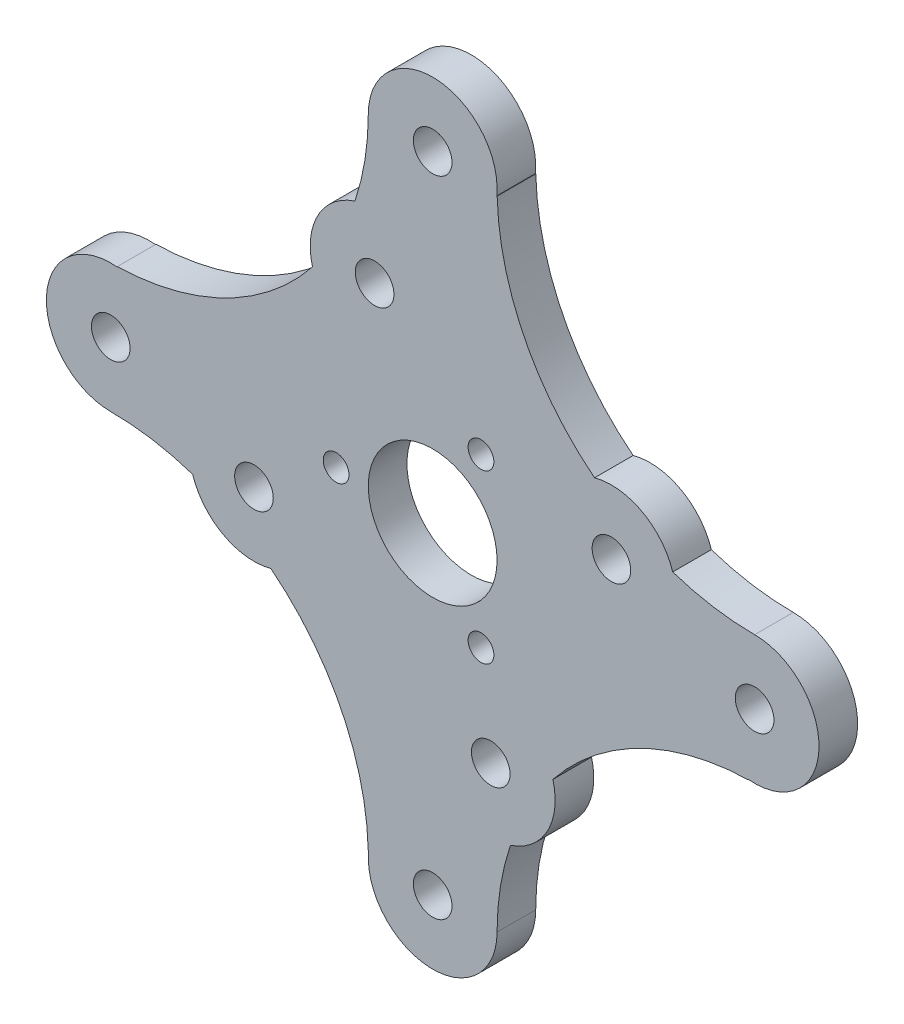
ISO-10303-21;
HEADER;
FILE_DESCRIPTION(('STEP AP214'),'2;1');
FILE_NAME('part.step','',(''),(''),'','','');
FILE_SCHEMA(('AUTOMOTIVE_DESIGN { 1 0 10303 214 1 1 1 1 }'));
ENDSEC;
DATA;
#1=APPLICATION_CONTEXT('core data for automotive mechanical design processes');
#2=APPLICATION_PROTOCOL_DEFINITION('international standard','automotive_design',2000,#1);
#3=PRODUCT_CONTEXT('',#1,'mechanical');
#4=PRODUCT('Part','Part','',(#3));
#5=PRODUCT_RELATED_PRODUCT_CATEGORY('part','',(#4));
#6=PRODUCT_DEFINITION_FORMATION('','',#4);
#7=PRODUCT_DEFINITION_CONTEXT('part definition',#1,'design');
#8=PRODUCT_DEFINITION('design','',#6,#7);
#9=PRODUCT_DEFINITION_SHAPE('','',#8);
#10=(LENGTH_UNIT() NAMED_UNIT(*) SI_UNIT(.MILLI.,.METRE.));
#11=(NAMED_UNIT(*) PLANE_ANGLE_UNIT() SI_UNIT($,.RADIAN.));
#12=(NAMED_UNIT(*) SI_UNIT($,.STERADIAN.) SOLID_ANGLE_UNIT());
#13=UNCERTAINTY_MEASURE_WITH_UNIT(LENGTH_MEASURE(1.E-05),#10,'distance_accuracy_value','');
#14=(GEOMETRIC_REPRESENTATION_CONTEXT(3) GLOBAL_UNCERTAINTY_ASSIGNED_CONTEXT((#13)) GLOBAL_UNIT_ASSIGNED_CONTEXT((#10,
#11,#12)) REPRESENTATION_CONTEXT('',''));
#15=CARTESIAN_POINT('',(0.,0.,0.));
#16=DIRECTION('',(0.,0.,1.));
#17=DIRECTION('',(1.,0.,0.));
#18=AXIS2_PLACEMENT_3D('',#15,#16,#17);
#19=CARTESIAN_POINT('',(13.8796616293915,4.50977544043731,3.));
#20=DIRECTION('',(0.,0.,-1.));
#21=DIRECTION('',(-1.,0.,0.));
#22=AXIS2_PLACEMENT_3D('',#19,#20,#21);
#23=CYLINDRICAL_SURFACE('',#22,5.);
#24=CARTESIAN_POINT('',(13.8796616293915,4.50977544043731,0.));
#25=DIRECTION('',(0.,0.,1.));
#26=DIRECTION('',(1.,0.,0.));
#27=AXIS2_PLACEMENT_3D('',#24,#25,#26);
#28=CIRCLE('',#27,5.);
#29=CARTESIAN_POINT('',(18.6403696579388,6.03806175750134,0.));
#30=VERTEX_POINT('',#29);
#31=CARTESIAN_POINT('',(12.5667239097199,9.33431630400803,0.));
#32=VERTEX_POINT('',#31);
#33=EDGE_CURVE('E236',#30,#32,#28,.T.);
#34=ORIENTED_EDGE('',*,*,#33,.T.);
#35=DIRECTION('',(0.,0.,-1.));
#36=VECTOR('',#35,1.);
#37=CARTESIAN_POINT('',(12.5667239097199,9.33431630400803,3.));
#38=LINE('',#37,#36);
#39=CARTESIAN_POINT('',(12.5667239097199,9.33431630400803,3.));
#40=VERTEX_POINT('',#39);
#41=EDGE_CURVE('E11',#40,#32,#38,.T.);
#42=ORIENTED_EDGE('',*,*,#41,.F.);
#43=CARTESIAN_POINT('',(13.8796616293915,4.50977544043731,3.));
#44=DIRECTION('',(0.,0.,1.));
#45=DIRECTION('',(1.,0.,0.));
#46=AXIS2_PLACEMENT_3D('',#43,#44,#45);
#47=CIRCLE('',#46,5.);
#48=CARTESIAN_POINT('',(18.6403696579388,6.03806175750134,3.));
#49=VERTEX_POINT('',#48);
#50=EDGE_CURVE('E126',#49,#40,#47,.T.);
#51=ORIENTED_EDGE('',*,*,#50,.F.);
#52=DIRECTION('',(0.,0.,-1.));
#53=VECTOR('',#52,1.);
#54=CARTESIAN_POINT('',(18.6403696579388,6.03806175750134,3.));
#55=LINE('',#54,#53);
#56=EDGE_CURVE('E52',#49,#30,#55,.T.);
#57=ORIENTED_EDGE('',*,*,#56,.T.);
#58=EDGE_LOOP('',(#34,#42,#51,#57));
#59=FACE_BOUND('',#58,.T.);
#60=ADVANCED_FACE('F35',(#59),#23,.T.);
#61=CARTESIAN_POINT('',(25.0000000000001,25.0000000000001,3.));
#62=DIRECTION('',(0.,0.,-1.));
#63=DIRECTION('',(-1.,0.,0.));
#64=AXIS2_PLACEMENT_3D('',#61,#62,#63);
#65=CYLINDRICAL_SURFACE('',#64,20.0000000000001);
#66=CARTESIAN_POINT('',(25.0000000000001,25.0000000000001,0.));
#67=DIRECTION('',(0.,0.,1.));
#68=DIRECTION('',(1.,0.,0.));
#69=AXIS2_PLACEMENT_3D('',#66,#67,#68);
#70=CIRCLE('',#69,20.0000000000001);
#71=CARTESIAN_POINT('',(5.00641236504747,24.4935876349525,0.));
#72=VERTEX_POINT('',#71);
#73=EDGE_CURVE('E238',#72,#32,#70,.T.);
#74=ORIENTED_EDGE('',*,*,#73,.F.);
#75=DIRECTION('',(0.,0.,-1.));
#76=VECTOR('',#75,1.);
#77=CARTESIAN_POINT('',(5.00641236504747,24.4935876349525,3.));
#78=LINE('',#77,#76);
#79=CARTESIAN_POINT('',(5.00641236504747,24.4935876349525,3.));
#80=VERTEX_POINT('',#79);
#81=EDGE_CURVE('E44',#80,#72,#78,.T.);
#82=ORIENTED_EDGE('',*,*,#81,.F.);
#83=CARTESIAN_POINT('',(25.0000000000001,25.0000000000001,3.));
#84=DIRECTION('',(0.,0.,1.));
#85=DIRECTION('',(1.,0.,0.));
#86=AXIS2_PLACEMENT_3D('',#83,#84,#85);
#87=CIRCLE('',#86,20.0000000000001);
#88=EDGE_CURVE('E204',#80,#40,#87,.T.);
#89=ORIENTED_EDGE('',*,*,#88,.T.);
#90=ORIENTED_EDGE('',*,*,#41,.T.);
#91=EDGE_LOOP('',(#74,#82,#89,#90));
#92=FACE_BOUND('',#91,.T.);
#93=ADVANCED_FACE('F341',(#92),#65,.F.);
#94=CARTESIAN_POINT('',(0.,0.,3.));
#95=DIRECTION('',(0.,0.,-1.));
#96=DIRECTION('',(-1.,0.,0.));
#97=AXIS2_PLACEMENT_3D('',#94,#95,#96);
#98=CYLINDRICAL_SURFACE('',#97,25.);
#99=CARTESIAN_POINT('',(0.,0.,0.));
#100=DIRECTION('',(0.,0.,1.));
#101=DIRECTION('',(1.,0.,0.));
#102=AXIS2_PLACEMENT_3D('',#99,#100,#101);
#103=CIRCLE('',#102,25.);
#104=CARTESIAN_POINT('',(4.9749371855331,24.5,0.));
#105=VERTEX_POINT('',#104);
#106=EDGE_CURVE('E241',#72,#105,#103,.T.);
#107=ORIENTED_EDGE('',*,*,#106,.T.);
#108=DIRECTION('',(0.,0.,-1.));
#109=VECTOR('',#108,1.);
#110=CARTESIAN_POINT('',(4.9749371855331,24.5,3.));
#111=LINE('',#110,#109);
#112=CARTESIAN_POINT('',(4.9749371855331,24.5,3.));
#113=VERTEX_POINT('',#112);
#114=EDGE_CURVE('E326',#113,#105,#111,.T.);
#115=ORIENTED_EDGE('',*,*,#114,.F.);
#116=CARTESIAN_POINT('',(0.,0.,3.));
#117=DIRECTION('',(0.,0.,1.));
#118=DIRECTION('',(1.,0.,0.));
#119=AXIS2_PLACEMENT_3D('',#116,#117,#118);
#120=CIRCLE('',#119,25.);
#121=EDGE_CURVE('E189',#80,#113,#120,.T.);
#122=ORIENTED_EDGE('',*,*,#121,.F.);
#123=ORIENTED_EDGE('',*,*,#81,.T.);
#124=EDGE_LOOP('',(#107,#115,#122,#123));
#125=FACE_BOUND('',#124,.T.);
#126=ADVANCED_FACE('F331',(#125),#98,.T.);
#127=CARTESIAN_POINT('',(0.,25.,3.));
#128=DIRECTION('',(0.,0.,-1.));
#129=DIRECTION('',(-1.,0.,0.));
#130=AXIS2_PLACEMENT_3D('',#127,#128,#129);
#131=CYLINDRICAL_SURFACE('',#130,5.);
#132=CARTESIAN_POINT('',(0.,25.,0.));
#133=DIRECTION('',(0.,0.,1.));
#134=DIRECTION('',(1.,0.,0.));
#135=AXIS2_PLACEMENT_3D('',#132,#133,#134);
#136=CIRCLE('',#135,5.);
#137=CARTESIAN_POINT('',(-5.,25.,0.));
#138=VERTEX_POINT('',#137);
#139=EDGE_CURVE('E244',#105,#138,#136,.T.);
#140=ORIENTED_EDGE('',*,*,#139,.T.);
#141=DIRECTION('',(0.,0.,-1.));
#142=VECTOR('',#141,1.);
#143=CARTESIAN_POINT('',(-5.,25.,3.));
#144=LINE('',#143,#142);
#145=CARTESIAN_POINT('',(-5.,25.,3.));
#146=VERTEX_POINT('',#145);
#147=EDGE_CURVE('E323',#146,#138,#144,.T.);
#148=ORIENTED_EDGE('',*,*,#147,.F.);
#149=CARTESIAN_POINT('',(0.,25.,3.));
#150=DIRECTION('',(0.,0.,1.));
#151=DIRECTION('',(1.,0.,0.));
#152=AXIS2_PLACEMENT_3D('',#149,#150,#151);
#153=CIRCLE('',#152,5.);
#154=EDGE_CURVE('E552',#113,#146,#153,.T.);
#155=ORIENTED_EDGE('',*,*,#154,.F.);
#156=ORIENTED_EDGE('',*,*,#114,.T.);
#157=EDGE_LOOP('',(#140,#148,#155,#156));
#158=FACE_BOUND('',#157,.T.);
#159=ADVANCED_FACE('F365',(#158),#131,.T.);
#160=CARTESIAN_POINT('',(-25.,25.,3.));
#161=DIRECTION('',(0.,0.,-1.));
#162=DIRECTION('',(-1.,0.,0.));
#163=AXIS2_PLACEMENT_3D('',#160,#161,#162);
#164=CYLINDRICAL_SURFACE('',#163,20.);
#165=CARTESIAN_POINT('',(-25.,25.,0.));
#166=DIRECTION('',(0.,0.,1.));
#167=DIRECTION('',(1.,0.,0.));
#168=AXIS2_PLACEMENT_3D('',#165,#166,#167);
#169=CIRCLE('',#168,20.);
#170=CARTESIAN_POINT('',(-6.03806175750132,18.6403696579388,0.));
#171=VERTEX_POINT('',#170);
#172=EDGE_CURVE('E247',#138,#171,#169,.F.);
#173=ORIENTED_EDGE('',*,*,#172,.T.);
#174=DIRECTION('',(0.,0.,-1.));
#175=VECTOR('',#174,1.);
#176=CARTESIAN_POINT('',(-6.03806175750132,18.6403696579388,3.));
#177=LINE('',#176,#175);
#178=CARTESIAN_POINT('',(-6.03806175750132,18.6403696579388,3.));
#179=VERTEX_POINT('',#178);
#180=EDGE_CURVE('E320',#179,#171,#177,.T.);
#181=ORIENTED_EDGE('',*,*,#180,.F.);
#182=CARTESIAN_POINT('',(-25.,25.,3.));
#183=DIRECTION('',(0.,0.,1.));
#184=DIRECTION('',(1.,0.,0.));
#185=AXIS2_PLACEMENT_3D('',#182,#183,#184);
#186=CIRCLE('',#185,20.);
#187=EDGE_CURVE('E555',#146,#179,#186,.F.);
#188=ORIENTED_EDGE('',*,*,#187,.F.);
#189=ORIENTED_EDGE('',*,*,#147,.T.);
#190=EDGE_LOOP('',(#173,#181,#188,#189));
#191=FACE_BOUND('',#190,.T.);
#192=ADVANCED_FACE('F640',(#191),#164,.F.);
#193=CARTESIAN_POINT('',(-4.50977544043731,13.8796616293915,3.));
#194=DIRECTION('',(0.,0.,-1.));
#195=DIRECTION('',(-1.,0.,0.));
#196=AXIS2_PLACEMENT_3D('',#193,#194,#195);
#197=CYLINDRICAL_SURFACE('',#196,5.);
#198=CARTESIAN_POINT('',(-4.50977544043731,13.8796616293915,0.));
#199=DIRECTION('',(0.,0.,1.));
#200=DIRECTION('',(1.,0.,0.));
#201=AXIS2_PLACEMENT_3D('',#198,#199,#200);
#202=CIRCLE('',#201,5.);
#203=CARTESIAN_POINT('',(-9.33431630400802,12.5667239097199,0.));
#204=VERTEX_POINT('',#203);
#205=EDGE_CURVE('E249',#171,#204,#202,.T.);
#206=ORIENTED_EDGE('',*,*,#205,.T.);
#207=DIRECTION('',(0.,0.,-1.));
#208=VECTOR('',#207,1.);
#209=CARTESIAN_POINT('',(-9.33431630400802,12.5667239097199,3.));
#210=LINE('',#209,#208);
#211=CARTESIAN_POINT('',(-9.33431630400802,12.5667239097199,3.));
#212=VERTEX_POINT('',#211);
#213=EDGE_CURVE('E317',#212,#204,#210,.T.);
#214=ORIENTED_EDGE('',*,*,#213,.F.);
#215=CARTESIAN_POINT('',(-4.50977544043731,13.8796616293915,3.));
#216=DIRECTION('',(0.,0.,1.));
#217=DIRECTION('',(1.,0.,0.));
#218=AXIS2_PLACEMENT_3D('',#215,#216,#217);
#219=CIRCLE('',#218,5.);
#220=EDGE_CURVE('E557',#179,#212,#219,.T.);
#221=ORIENTED_EDGE('',*,*,#220,.F.);
#222=ORIENTED_EDGE('',*,*,#180,.T.);
#223=EDGE_LOOP('',(#206,#214,#221,#222));
#224=FACE_BOUND('',#223,.T.);
#225=ADVANCED_FACE('F638',(#224),#197,.T.);
#226=CARTESIAN_POINT('',(-24.4935876349525,5.00641236504747,0.));
#227=VERTEX_POINT('',#226);
#228=EDGE_CURVE('E250',#204,#227,#169,.F.);
#229=ORIENTED_EDGE('',*,*,#228,.T.);
#230=DIRECTION('',(0.,0.,-1.));
#231=VECTOR('',#230,1.);
#232=CARTESIAN_POINT('',(-24.4935876349525,5.00641236504747,3.));
#233=LINE('',#232,#231);
#234=CARTESIAN_POINT('',(-24.4935876349525,5.00641236504747,3.));
#235=VERTEX_POINT('',#234);
#236=EDGE_CURVE('E314',#235,#227,#233,.T.);
#237=ORIENTED_EDGE('',*,*,#236,.F.);
#238=EDGE_CURVE('E558',#212,#235,#186,.F.);
#239=ORIENTED_EDGE('',*,*,#238,.F.);
#240=ORIENTED_EDGE('',*,*,#213,.T.);
#241=EDGE_LOOP('',(#229,#237,#239,#240));
#242=FACE_BOUND('',#241,.T.);
#243=ADVANCED_FACE('F589',(#242),#164,.F.);
#244=CARTESIAN_POINT('',(-24.5,4.9749371855331,0.));
#245=VERTEX_POINT('',#244);
#246=EDGE_CURVE('E245',#227,#245,#103,.T.);
#247=ORIENTED_EDGE('',*,*,#246,.T.);
#248=DIRECTION('',(0.,0.,-1.));
#249=VECTOR('',#248,1.);
#250=CARTESIAN_POINT('',(-24.5,4.9749371855331,3.));
#251=LINE('',#250,#249);
#252=CARTESIAN_POINT('',(-24.5,4.9749371855331,3.));
#253=VERTEX_POINT('',#252);
#254=EDGE_CURVE('E311',#253,#245,#251,.T.);
#255=ORIENTED_EDGE('',*,*,#254,.F.);
#256=EDGE_CURVE('E553',#235,#253,#120,.T.);
#257=ORIENTED_EDGE('',*,*,#256,.F.);
#258=ORIENTED_EDGE('',*,*,#236,.T.);
#259=EDGE_LOOP('',(#247,#255,#257,#258));
#260=FACE_BOUND('',#259,.T.);
#261=ADVANCED_FACE('F594',(#260),#98,.T.);
#262=CARTESIAN_POINT('',(-25.,0.,3.));
#263=DIRECTION('',(0.,0.,-1.));
#264=DIRECTION('',(-1.,0.,0.));
#265=AXIS2_PLACEMENT_3D('',#262,#263,#264);
#266=CYLINDRICAL_SURFACE('',#265,5.);
#267=CARTESIAN_POINT('',(-25.,0.,0.));
#268=DIRECTION('',(0.,0.,1.));
#269=DIRECTION('',(1.,0.,0.));
#270=AXIS2_PLACEMENT_3D('',#267,#268,#269);
#271=CIRCLE('',#270,5.);
#272=CARTESIAN_POINT('',(-25.,-5.,0.));
#273=VERTEX_POINT('',#272);
#274=EDGE_CURVE('E252',#245,#273,#271,.T.);
#275=ORIENTED_EDGE('',*,*,#274,.T.);
#276=DIRECTION('',(0.,0.,-1.));
#277=VECTOR('',#276,1.);
#278=CARTESIAN_POINT('',(-25.,-5.,3.));
#279=LINE('',#278,#277);
#280=CARTESIAN_POINT('',(-25.,-5.,3.));
#281=VERTEX_POINT('',#280);
#282=EDGE_CURVE('E309',#281,#273,#279,.T.);
#283=ORIENTED_EDGE('',*,*,#282,.F.);
#284=CARTESIAN_POINT('',(-25.,0.,3.));
#285=DIRECTION('',(0.,0.,1.));
#286=DIRECTION('',(1.,0.,0.));
#287=AXIS2_PLACEMENT_3D('',#284,#285,#286);
#288=CIRCLE('',#287,5.);
#289=EDGE_CURVE('E560',#253,#281,#288,.T.);
#290=ORIENTED_EDGE('',*,*,#289,.F.);
#291=ORIENTED_EDGE('',*,*,#254,.T.);
#292=EDGE_LOOP('',(#275,#283,#290,#291));
#293=FACE_BOUND('',#292,.T.);
#294=ADVANCED_FACE('F600',(#293),#266,.T.);
#295=CARTESIAN_POINT('',(-25.0000000000002,-25.0000000000002,3.));
#296=DIRECTION('',(0.,0.,-1.));
#297=DIRECTION('',(-1.,0.,0.));
#298=AXIS2_PLACEMENT_3D('',#295,#296,#297);
#299=CYLINDRICAL_SURFACE('',#298,20.0000000000002);
#300=CARTESIAN_POINT('',(-25.0000000000002,-25.0000000000002,0.));
#301=DIRECTION('',(0.,0.,1.));
#302=DIRECTION('',(1.,0.,0.));
#303=AXIS2_PLACEMENT_3D('',#300,#301,#302);
#304=CIRCLE('',#303,20.0000000000002);
#305=CARTESIAN_POINT('',(-18.6403696579388,-6.03806175750137,0.));
#306=VERTEX_POINT('',#305);
#307=EDGE_CURVE('E255',#306,#273,#304,.T.);
#308=ORIENTED_EDGE('',*,*,#307,.F.);
#309=DIRECTION('',(0.,0.,-1.));
#310=VECTOR('',#309,1.);
#311=CARTESIAN_POINT('',(-18.6403696579388,-6.03806175750137,3.));
#312=LINE('',#311,#310);
#313=CARTESIAN_POINT('',(-18.6403696579388,-6.03806175750137,3.));
#314=VERTEX_POINT('',#313);
#315=EDGE_CURVE('E307',#314,#306,#312,.T.);
#316=ORIENTED_EDGE('',*,*,#315,.F.);
#317=CARTESIAN_POINT('',(-25.0000000000002,-25.0000000000002,3.));
#318=DIRECTION('',(0.,0.,1.));
#319=DIRECTION('',(1.,0.,0.));
#320=AXIS2_PLACEMENT_3D('',#317,#318,#319);
#321=CIRCLE('',#320,20.0000000000002);
#322=EDGE_CURVE('E562',#314,#281,#321,.T.);
#323=ORIENTED_EDGE('',*,*,#322,.T.);
#324=ORIENTED_EDGE('',*,*,#282,.T.);
#325=EDGE_LOOP('',(#308,#316,#323,#324));
#326=FACE_BOUND('',#325,.T.);
#327=ADVANCED_FACE('F629',(#326),#299,.F.);
#328=CARTESIAN_POINT('',(-13.8796616293915,-4.50977544043731,3.));
#329=DIRECTION('',(0.,0.,-1.));
#330=DIRECTION('',(-1.,0.,0.));
#331=AXIS2_PLACEMENT_3D('',#328,#329,#330);
#332=CYLINDRICAL_SURFACE('',#331,5.);
#333=CARTESIAN_POINT('',(-13.8796616293915,-4.50977544043731,0.));
#334=DIRECTION('',(0.,0.,1.));
#335=DIRECTION('',(1.,0.,0.));
#336=AXIS2_PLACEMENT_3D('',#333,#334,#335);
#337=CIRCLE('',#336,5.);
#338=CARTESIAN_POINT('',(-12.56672390972,-9.33431630400804,0.));
#339=VERTEX_POINT('',#338);
#340=EDGE_CURVE('E258',#306,#339,#337,.T.);
#341=ORIENTED_EDGE('',*,*,#340,.T.);
#342=DIRECTION('',(0.,0.,-1.));
#343=VECTOR('',#342,1.);
#344=CARTESIAN_POINT('',(-12.56672390972,-9.33431630400804,3.));
#345=LINE('',#344,#343);
#346=CARTESIAN_POINT('',(-12.56672390972,-9.33431630400804,3.));
#347=VERTEX_POINT('',#346);
#348=EDGE_CURVE('E305',#347,#339,#345,.T.);
#349=ORIENTED_EDGE('',*,*,#348,.F.);
#350=CARTESIAN_POINT('',(-13.8796616293915,-4.50977544043731,3.));
#351=DIRECTION('',(0.,0.,1.));
#352=DIRECTION('',(1.,0.,0.));
#353=AXIS2_PLACEMENT_3D('',#350,#351,#352);
#354=CIRCLE('',#353,5.);
#355=EDGE_CURVE('E565',#314,#347,#354,.T.);
#356=ORIENTED_EDGE('',*,*,#355,.F.);
#357=ORIENTED_EDGE('',*,*,#315,.T.);
#358=EDGE_LOOP('',(#341,#349,#356,#357));
#359=FACE_BOUND('',#358,.T.);
#360=ADVANCED_FACE('F612',(#359),#332,.T.);
#361=CARTESIAN_POINT('',(-5.00641236504747,-24.4935876349525,0.));
#362=VERTEX_POINT('',#361);
#363=EDGE_CURVE('E259',#362,#339,#304,.T.);
#364=ORIENTED_EDGE('',*,*,#363,.F.);
#365=DIRECTION('',(0.,0.,-1.));
#366=VECTOR('',#365,1.);
#367=CARTESIAN_POINT('',(-5.00641236504747,-24.4935876349525,3.));
#368=LINE('',#367,#366);
#369=CARTESIAN_POINT('',(-5.00641236504747,-24.4935876349525,3.));
#370=VERTEX_POINT('',#369);
#371=EDGE_CURVE('E303',#370,#362,#368,.T.);
#372=ORIENTED_EDGE('',*,*,#371,.F.);
#373=EDGE_CURVE('E566',#370,#347,#321,.T.);
#374=ORIENTED_EDGE('',*,*,#373,.T.);
#375=ORIENTED_EDGE('',*,*,#348,.T.);
#376=EDGE_LOOP('',(#364,#372,#374,#375));
#377=FACE_BOUND('',#376,.T.);
#378=ADVANCED_FACE('F608',(#377),#299,.F.);
#379=CARTESIAN_POINT('',(-4.9749371855331,-24.5,0.));
#380=VERTEX_POINT('',#379);
#381=EDGE_CURVE('E266',#362,#380,#103,.T.);
#382=ORIENTED_EDGE('',*,*,#381,.T.);
#383=DIRECTION('',(0.,0.,-1.));
#384=VECTOR('',#383,1.);
#385=CARTESIAN_POINT('',(-4.9749371855331,-24.5,3.));
#386=LINE('',#385,#384);
#387=CARTESIAN_POINT('',(-4.9749371855331,-24.5,3.));
#388=VERTEX_POINT('',#387);
#389=EDGE_CURVE('E300',#388,#380,#386,.T.);
#390=ORIENTED_EDGE('',*,*,#389,.F.);
#391=EDGE_CURVE('E188',#370,#388,#120,.T.);
#392=ORIENTED_EDGE('',*,*,#391,.F.);
#393=ORIENTED_EDGE('',*,*,#371,.T.);
#394=EDGE_LOOP('',(#382,#390,#392,#393));
#395=FACE_BOUND('',#394,.T.);
#396=ADVANCED_FACE('F619',(#395),#98,.T.);
#397=CARTESIAN_POINT('',(0.,-25.,3.));
#398=DIRECTION('',(0.,0.,-1.));
#399=DIRECTION('',(-1.,0.,0.));
#400=AXIS2_PLACEMENT_3D('',#397,#398,#399);
#401=CYLINDRICAL_SURFACE('',#400,5.);
#402=CARTESIAN_POINT('',(0.,-25.,0.));
#403=DIRECTION('',(0.,0.,1.));
#404=DIRECTION('',(1.,0.,0.));
#405=AXIS2_PLACEMENT_3D('',#402,#403,#404);
#406=CIRCLE('',#405,5.);
#407=CARTESIAN_POINT('',(5.,-25.,0.));
#408=VERTEX_POINT('',#407);
#409=EDGE_CURVE('E262',#380,#408,#406,.T.);
#410=ORIENTED_EDGE('',*,*,#409,.T.);
#411=DIRECTION('',(0.,0.,-1.));
#412=VECTOR('',#411,1.);
#413=CARTESIAN_POINT('',(5.,-25.,3.));
#414=LINE('',#413,#412);
#415=CARTESIAN_POINT('',(5.,-25.,3.));
#416=VERTEX_POINT('',#415);
#417=EDGE_CURVE('E298',#416,#408,#414,.T.);
#418=ORIENTED_EDGE('',*,*,#417,.F.);
#419=CARTESIAN_POINT('',(0.,-25.,3.));
#420=DIRECTION('',(0.,0.,1.));
#421=DIRECTION('',(1.,0.,0.));
#422=AXIS2_PLACEMENT_3D('',#419,#420,#421);
#423=CIRCLE('',#422,5.);
#424=EDGE_CURVE('E568',#388,#416,#423,.T.);
#425=ORIENTED_EDGE('',*,*,#424,.F.);
#426=ORIENTED_EDGE('',*,*,#389,.T.);
#427=EDGE_LOOP('',(#410,#418,#425,#426));
#428=FACE_BOUND('',#427,.T.);
#429=ADVANCED_FACE('F617',(#428),#401,.T.);
#430=CARTESIAN_POINT('',(25.,-25.,3.));
#431=DIRECTION('',(0.,0.,-1.));
#432=DIRECTION('',(-1.,0.,0.));
#433=AXIS2_PLACEMENT_3D('',#430,#431,#432);
#434=CYLINDRICAL_SURFACE('',#433,20.);
#435=CARTESIAN_POINT('',(25.,-25.,0.));
#436=DIRECTION('',(0.,0.,1.));
#437=DIRECTION('',(1.,0.,0.));
#438=AXIS2_PLACEMENT_3D('',#435,#436,#437);
#439=CIRCLE('',#438,20.);
#440=CARTESIAN_POINT('',(6.03806175750132,-18.6403696579388,0.));
#441=VERTEX_POINT('',#440);
#442=EDGE_CURVE('E265',#441,#408,#439,.T.);
#443=ORIENTED_EDGE('',*,*,#442,.F.);
#444=DIRECTION('',(0.,0.,-1.));
#445=VECTOR('',#444,1.);
#446=CARTESIAN_POINT('',(6.03806175750132,-18.6403696579388,3.));
#447=LINE('',#446,#445);
#448=CARTESIAN_POINT('',(6.03806175750132,-18.6403696579388,3.));
#449=VERTEX_POINT('',#448);
#450=EDGE_CURVE('E296',#449,#441,#447,.T.);
#451=ORIENTED_EDGE('',*,*,#450,.F.);
#452=CARTESIAN_POINT('',(25.,-25.,3.));
#453=DIRECTION('',(0.,0.,1.));
#454=DIRECTION('',(1.,0.,0.));
#455=AXIS2_PLACEMENT_3D('',#452,#453,#454);
#456=CIRCLE('',#455,20.);
#457=EDGE_CURVE('E569',#449,#416,#456,.T.);
#458=ORIENTED_EDGE('',*,*,#457,.T.);
#459=ORIENTED_EDGE('',*,*,#417,.T.);
#460=EDGE_LOOP('',(#443,#451,#458,#459));
#461=FACE_BOUND('',#460,.T.);
#462=ADVANCED_FACE('F626',(#461),#434,.F.);
#463=CARTESIAN_POINT('',(4.50977544043731,-13.8796616293915,3.));
#464=DIRECTION('',(0.,0.,-1.));
#465=DIRECTION('',(-1.,0.,0.));
#466=AXIS2_PLACEMENT_3D('',#463,#464,#465);
#467=CYLINDRICAL_SURFACE('',#466,5.);
#468=CARTESIAN_POINT('',(4.50977544043731,-13.8796616293915,0.));
#469=DIRECTION('',(0.,0.,1.));
#470=DIRECTION('',(1.,0.,0.));
#471=AXIS2_PLACEMENT_3D('',#468,#469,#470);
#472=CIRCLE('',#471,5.);
#473=CARTESIAN_POINT('',(9.33431630400803,-12.5667239097199,0.));
#474=VERTEX_POINT('',#473);
#475=EDGE_CURVE('E269',#441,#474,#472,.T.);
#476=ORIENTED_EDGE('',*,*,#475,.T.);
#477=DIRECTION('',(0.,0.,-1.));
#478=VECTOR('',#477,1.);
#479=CARTESIAN_POINT('',(9.33431630400803,-12.5667239097199,3.));
#480=LINE('',#479,#478);
#481=CARTESIAN_POINT('',(9.33431630400803,-12.5667239097199,3.));
#482=VERTEX_POINT('',#481);
#483=EDGE_CURVE('E294',#482,#474,#480,.T.);
#484=ORIENTED_EDGE('',*,*,#483,.F.);
#485=CARTESIAN_POINT('',(4.50977544043731,-13.8796616293915,3.));
#486=DIRECTION('',(0.,0.,1.));
#487=DIRECTION('',(1.,0.,0.));
#488=AXIS2_PLACEMENT_3D('',#485,#486,#487);
#489=CIRCLE('',#488,5.);
#490=EDGE_CURVE('E207',#449,#482,#489,.T.);
#491=ORIENTED_EDGE('',*,*,#490,.F.);
#492=ORIENTED_EDGE('',*,*,#450,.T.);
#493=EDGE_LOOP('',(#476,#484,#491,#492));
#494=FACE_BOUND('',#493,.T.);
#495=ADVANCED_FACE('F662',(#494),#467,.T.);
#496=CARTESIAN_POINT('',(24.4935876349525,-5.00641236504746,0.));
#497=VERTEX_POINT('',#496);
#498=EDGE_CURVE('E270',#497,#474,#439,.T.);
#499=ORIENTED_EDGE('',*,*,#498,.F.);
#500=DIRECTION('',(0.,0.,-1.));
#501=VECTOR('',#500,1.);
#502=CARTESIAN_POINT('',(24.4935876349525,-5.00641236504746,3.));
#503=LINE('',#502,#501);
#504=CARTESIAN_POINT('',(24.4935876349525,-5.00641236504746,3.));
#505=VERTEX_POINT('',#504);
#506=EDGE_CURVE('E197',#505,#497,#503,.T.);
#507=ORIENTED_EDGE('',*,*,#506,.F.);
#508=EDGE_CURVE('E185',#505,#482,#456,.T.);
#509=ORIENTED_EDGE('',*,*,#508,.T.);
#510=ORIENTED_EDGE('',*,*,#483,.T.);
#511=EDGE_LOOP('',(#499,#507,#509,#510));
#512=FACE_BOUND('',#511,.T.);
#513=ADVANCED_FACE('F575',(#512),#434,.F.);
#514=CARTESIAN_POINT('',(24.5,-4.9749371855331,0.));
#515=VERTEX_POINT('',#514);
#516=EDGE_CURVE('E194',#497,#515,#103,.T.);
#517=ORIENTED_EDGE('',*,*,#516,.T.);
#518=DIRECTION('',(0.,0.,-1.));
#519=VECTOR('',#518,1.);
#520=CARTESIAN_POINT('',(24.5,-4.9749371855331,3.));
#521=LINE('',#520,#519);
#522=CARTESIAN_POINT('',(24.5,-4.9749371855331,3.));
#523=VERTEX_POINT('',#522);
#524=EDGE_CURVE('E191',#523,#515,#521,.T.);
#525=ORIENTED_EDGE('',*,*,#524,.F.);
#526=EDGE_CURVE('E178',#505,#523,#120,.T.);
#527=ORIENTED_EDGE('',*,*,#526,.F.);
#528=ORIENTED_EDGE('',*,*,#506,.T.);
#529=EDGE_LOOP('',(#517,#525,#527,#528));
#530=FACE_BOUND('',#529,.T.);
#531=ADVANCED_FACE('F192',(#530),#98,.T.);
#532=CARTESIAN_POINT('',(25.,0.,3.));
#533=DIRECTION('',(0.,0.,-1.));
#534=DIRECTION('',(-1.,0.,0.));
#535=AXIS2_PLACEMENT_3D('',#532,#533,#534);
#536=CYLINDRICAL_SURFACE('',#535,5.);
#537=CARTESIAN_POINT('',(25.,0.,0.));
#538=DIRECTION('',(0.,0.,1.));
#539=DIRECTION('',(1.,0.,0.));
#540=AXIS2_PLACEMENT_3D('',#537,#538,#539);
#541=CIRCLE('',#540,5.);
#542=CARTESIAN_POINT('',(25.,5.,0.));
#543=VERTEX_POINT('',#542);
#544=EDGE_CURVE('E273',#515,#543,#541,.T.);
#545=ORIENTED_EDGE('',*,*,#544,.T.);
#546=DIRECTION('',(0.,0.,-1.));
#547=VECTOR('',#546,1.);
#548=CARTESIAN_POINT('',(25.,5.,3.));
#549=LINE('',#548,#547);
#550=CARTESIAN_POINT('',(25.,5.,3.));
#551=VERTEX_POINT('',#550);
#552=EDGE_CURVE('E114',#551,#543,#549,.T.);
#553=ORIENTED_EDGE('',*,*,#552,.F.);
#554=CARTESIAN_POINT('',(25.,0.,3.));
#555=DIRECTION('',(0.,0.,1.));
#556=DIRECTION('',(1.,0.,0.));
#557=AXIS2_PLACEMENT_3D('',#554,#555,#556);
#558=CIRCLE('',#557,5.);
#559=EDGE_CURVE('E183',#523,#551,#558,.T.);
#560=ORIENTED_EDGE('',*,*,#559,.F.);
#561=ORIENTED_EDGE('',*,*,#524,.T.);
#562=EDGE_LOOP('',(#545,#553,#560,#561));
#563=FACE_BOUND('',#562,.T.);
#564=ADVANCED_FACE('F199',(#563),#536,.T.);
#565=CARTESIAN_POINT('',(-4.50977544043731,13.8796616293915,3.));
#566=DIRECTION('',(0.,0.,-1.));
#567=DIRECTION('',(-1.,0.,0.));
#568=AXIS2_PLACEMENT_3D('',#565,#566,#567);
#569=CYLINDRICAL_SURFACE('',#568,1.5);
#570=CARTESIAN_POINT('',(-4.50977544043731,13.8796616293915,3.));
#571=DIRECTION('',(0.,0.,1.));
#572=DIRECTION('',(1.,0.,0.));
#573=AXIS2_PLACEMENT_3D('',#570,#571,#572);
#574=CIRCLE('',#573,1.5);
#575=CARTESIAN_POINT('',(-3.00977544043731,13.8796616293915,3.));
#576=VERTEX_POINT('',#575);
#577=EDGE_CURVE('E217',#576,#576,#574,.T.);
#578=ORIENTED_EDGE('',*,*,#577,.T.);
#579=EDGE_LOOP('',(#578));
#580=FACE_BOUND('',#579,.T.);
#581=CARTESIAN_POINT('',(-4.50977544043731,13.8796616293915,0.));
#582=DIRECTION('',(0.,0.,1.));
#583=DIRECTION('',(1.,0.,0.));
#584=AXIS2_PLACEMENT_3D('',#581,#582,#583);
#585=CIRCLE('',#584,1.5);
#586=CARTESIAN_POINT('',(-3.00977544043731,13.8796616293915,0.));
#587=VERTEX_POINT('',#586);
#588=EDGE_CURVE('E284',#587,#587,#585,.T.);
#589=ORIENTED_EDGE('',*,*,#588,.F.);
#590=EDGE_LOOP('',(#589));
#591=FACE_BOUND('',#590,.T.);
#592=ADVANCED_FACE('F409',(#580,#591),#569,.F.);
#593=CARTESIAN_POINT('',(-13.8796616293915,-4.50977544043731,3.));
#594=DIRECTION('',(0.,0.,-1.));
#595=DIRECTION('',(-1.,0.,0.));
#596=AXIS2_PLACEMENT_3D('',#593,#594,#595);
#597=CYLINDRICAL_SURFACE('',#596,1.5);
#598=CARTESIAN_POINT('',(-13.8796616293915,-4.50977544043731,3.));
#599=DIRECTION('',(0.,0.,1.));
#600=DIRECTION('',(1.,0.,0.));
#601=AXIS2_PLACEMENT_3D('',#598,#599,#600);
#602=CIRCLE('',#601,1.5);
#603=CARTESIAN_POINT('',(-12.3796616293915,-4.50977544043731,3.));
#604=VERTEX_POINT('',#603);
#605=EDGE_CURVE('E214',#604,#604,#602,.T.);
#606=ORIENTED_EDGE('',*,*,#605,.T.);
#607=EDGE_LOOP('',(#606));
#608=FACE_BOUND('',#607,.T.);
#609=CARTESIAN_POINT('',(-13.8796616293915,-4.50977544043731,0.));
#610=DIRECTION('',(0.,0.,1.));
#611=DIRECTION('',(1.,0.,0.));
#612=AXIS2_PLACEMENT_3D('',#609,#610,#611);
#613=CIRCLE('',#612,1.5);
#614=CARTESIAN_POINT('',(-12.3796616293915,-4.50977544043731,0.));
#615=VERTEX_POINT('',#614);
#616=EDGE_CURVE('E281',#615,#615,#613,.T.);
#617=ORIENTED_EDGE('',*,*,#616,.F.);
#618=EDGE_LOOP('',(#617));
#619=FACE_BOUND('',#618,.T.);
#620=ADVANCED_FACE('F412',(#608,#619),#597,.F.);
#621=CARTESIAN_POINT('',(0.,0.,3.));
#622=DIRECTION('',(0.,0.,-1.));
#623=DIRECTION('',(-1.,0.,0.));
#624=AXIS2_PLACEMENT_3D('',#621,#622,#623);
#625=CYLINDRICAL_SURFACE('',#624,5.);
#626=CARTESIAN_POINT('',(0.,0.,3.));
#627=DIRECTION('',(0.,0.,1.));
#628=DIRECTION('',(1.,0.,0.));
#629=AXIS2_PLACEMENT_3D('',#626,#627,#628);
#630=CIRCLE('',#629,5.);
#631=CARTESIAN_POINT('',(5.,0.,3.));
#632=VERTEX_POINT('',#631);
#633=EDGE_CURVE('E211',#632,#632,#630,.T.);
#634=ORIENTED_EDGE('',*,*,#633,.T.);
#635=EDGE_LOOP('',(#634));
#636=FACE_BOUND('',#635,.T.);
#637=CARTESIAN_POINT('',(0.,0.,0.));
#638=DIRECTION('',(0.,0.,1.));
#639=DIRECTION('',(1.,0.,0.));
#640=AXIS2_PLACEMENT_3D('',#637,#638,#639);
#641=CIRCLE('',#640,5.);
#642=CARTESIAN_POINT('',(5.,0.,0.));
#643=VERTEX_POINT('',#642);
#644=EDGE_CURVE('E278',#643,#643,#641,.T.);
#645=ORIENTED_EDGE('',*,*,#644,.F.);
#646=EDGE_LOOP('',(#645));
#647=FACE_BOUND('',#646,.T.);
#648=ADVANCED_FACE('F355',(#636,#647),#625,.F.);
#649=CARTESIAN_POINT('',(13.8796616293915,4.50977544043731,3.));
#650=DIRECTION('',(0.,0.,-1.));
#651=DIRECTION('',(-1.,0.,0.));
#652=AXIS2_PLACEMENT_3D('',#649,#650,#651);
#653=CYLINDRICAL_SURFACE('',#652,1.5);
#654=CARTESIAN_POINT('',(13.8796616293915,4.50977544043731,3.));
#655=DIRECTION('',(0.,0.,1.));
#656=DIRECTION('',(1.,0.,0.));
#657=AXIS2_PLACEMENT_3D('',#654,#655,#656);
#658=CIRCLE('',#657,1.5);
#659=CARTESIAN_POINT('',(15.3796616293915,4.50977544043731,3.));
#660=VERTEX_POINT('',#659);
#661=EDGE_CURVE('E202',#660,#660,#658,.T.);
#662=ORIENTED_EDGE('',*,*,#661,.T.);
#663=EDGE_LOOP('',(#662));
#664=FACE_BOUND('',#663,.T.);
#665=CARTESIAN_POINT('',(13.8796616293915,4.50977544043731,0.));
#666=DIRECTION('',(0.,0.,1.));
#667=DIRECTION('',(1.,0.,0.));
#668=AXIS2_PLACEMENT_3D('',#665,#666,#667);
#669=CIRCLE('',#668,1.5);
#670=CARTESIAN_POINT('',(15.3796616293915,4.50977544043731,0.));
#671=VERTEX_POINT('',#670);
#672=EDGE_CURVE('E275',#671,#671,#669,.T.);
#673=ORIENTED_EDGE('',*,*,#672,.F.);
#674=EDGE_LOOP('',(#673));
#675=FACE_BOUND('',#674,.T.);
#676=ADVANCED_FACE('F346',(#664,#675),#653,.F.);
#677=EDGE_CURVE('E242',#30,#543,#70,.T.);
#678=ORIENTED_EDGE('',*,*,#677,.F.);
#679=ORIENTED_EDGE('',*,*,#56,.F.);
#680=EDGE_CURVE('E200',#49,#551,#87,.T.);
#681=ORIENTED_EDGE('',*,*,#680,.T.);
#682=ORIENTED_EDGE('',*,*,#552,.T.);
#683=EDGE_LOOP('',(#678,#679,#681,#682));
#684=FACE_BOUND('',#683,.T.);
#685=ADVANCED_FACE('F343',(#684),#65,.F.);
#686=CARTESIAN_POINT('',(0.,-25.,3.));
#687=DIRECTION('',(0.,0.,-1.));
#688=DIRECTION('',(-1.,0.,0.));
#689=AXIS2_PLACEMENT_3D('',#686,#687,#688);
#690=CYLINDRICAL_SURFACE('',#689,1.5);
#691=CARTESIAN_POINT('',(0.,-25.,3.));
#692=DIRECTION('',(0.,0.,1.));
#693=DIRECTION('',(1.,0.,0.));
#694=AXIS2_PLACEMENT_3D('',#691,#692,#693);
#695=CIRCLE('',#694,1.5);
#696=CARTESIAN_POINT('',(1.5,-25.,3.));
#697=VERTEX_POINT('',#696);
#698=EDGE_CURVE('E548',#697,#697,#695,.T.);
#699=ORIENTED_EDGE('',*,*,#698,.T.);
#700=EDGE_LOOP('',(#699));
#701=FACE_BOUND('',#700,.T.);
#702=CARTESIAN_POINT('',(0.,-25.,0.));
#703=DIRECTION('',(0.,0.,1.));
#704=DIRECTION('',(1.,0.,0.));
#705=AXIS2_PLACEMENT_3D('',#702,#703,#704);
#706=CIRCLE('',#705,1.5);
#707=CARTESIAN_POINT('',(1.5,-25.,0.));
#708=VERTEX_POINT('',#707);
#709=EDGE_CURVE('E233',#708,#708,#706,.T.);
#710=ORIENTED_EDGE('',*,*,#709,.F.);
#711=EDGE_LOOP('',(#710));
#712=FACE_BOUND('',#711,.T.);
#713=ADVANCED_FACE('F345',(#701,#712),#690,.F.);
#714=CARTESIAN_POINT('',(-25.,0.,3.));
#715=DIRECTION('',(0.,0.,-1.));
#716=DIRECTION('',(-1.,0.,0.));
#717=AXIS2_PLACEMENT_3D('',#714,#715,#716);
#718=CYLINDRICAL_SURFACE('',#717,1.5);
#719=CARTESIAN_POINT('',(-25.,0.,3.));
#720=DIRECTION('',(0.,0.,1.));
#721=DIRECTION('',(1.,0.,0.));
#722=AXIS2_PLACEMENT_3D('',#719,#720,#721);
#723=CIRCLE('',#722,1.5);
#724=CARTESIAN_POINT('',(-23.5,0.,3.));
#725=VERTEX_POINT('',#724);
#726=EDGE_CURVE('E545',#725,#725,#723,.T.);
#727=ORIENTED_EDGE('',*,*,#726,.T.);
#728=EDGE_LOOP('',(#727));
#729=FACE_BOUND('',#728,.T.);
#730=CARTESIAN_POINT('',(-25.,0.,0.));
#731=DIRECTION('',(0.,0.,1.));
#732=DIRECTION('',(1.,0.,0.));
#733=AXIS2_PLACEMENT_3D('',#730,#731,#732);
#734=CIRCLE('',#733,1.5);
#735=CARTESIAN_POINT('',(-23.5,0.,0.));
#736=VERTEX_POINT('',#735);
#737=EDGE_CURVE('E230',#736,#736,#734,.T.);
#738=ORIENTED_EDGE('',*,*,#737,.F.);
#739=EDGE_LOOP('',(#738));
#740=FACE_BOUND('',#739,.T.);
#741=ADVANCED_FACE('F352',(#729,#740),#718,.F.);
#742=CARTESIAN_POINT('',(0.,25.,3.));
#743=DIRECTION('',(0.,0.,-1.));
#744=DIRECTION('',(-1.,0.,0.));
#745=AXIS2_PLACEMENT_3D('',#742,#743,#744);
#746=CYLINDRICAL_SURFACE('',#745,1.5);
#747=CARTESIAN_POINT('',(0.,25.,3.));
#748=DIRECTION('',(0.,0.,1.));
#749=DIRECTION('',(1.,0.,0.));
#750=AXIS2_PLACEMENT_3D('',#747,#748,#749);
#751=CIRCLE('',#750,1.5);
#752=CARTESIAN_POINT('',(1.5,25.,3.));
#753=VERTEX_POINT('',#752);
#754=EDGE_CURVE('E381',#753,#753,#751,.T.);
#755=ORIENTED_EDGE('',*,*,#754,.T.);
#756=EDGE_LOOP('',(#755));
#757=FACE_BOUND('',#756,.T.);
#758=CARTESIAN_POINT('',(0.,25.,0.));
#759=DIRECTION('',(0.,0.,1.));
#760=DIRECTION('',(1.,0.,0.));
#761=AXIS2_PLACEMENT_3D('',#758,#759,#760);
#762=CIRCLE('',#761,1.5);
#763=CARTESIAN_POINT('',(1.5,25.,0.));
#764=VERTEX_POINT('',#763);
#765=EDGE_CURVE('E226',#764,#764,#762,.T.);
#766=ORIENTED_EDGE('',*,*,#765,.F.);
#767=EDGE_LOOP('',(#766));
#768=FACE_BOUND('',#767,.T.);
#769=ADVANCED_FACE('F369',(#757,#768),#746,.F.);
#770=CARTESIAN_POINT('',(25.,0.,3.));
#771=DIRECTION('',(0.,0.,-1.));
#772=DIRECTION('',(-1.,0.,0.));
#773=AXIS2_PLACEMENT_3D('',#770,#771,#772);
#774=CYLINDRICAL_SURFACE('',#773,1.5);
#775=CARTESIAN_POINT('',(25.,0.,3.));
#776=DIRECTION('',(0.,0.,1.));
#777=DIRECTION('',(1.,0.,0.));
#778=AXIS2_PLACEMENT_3D('',#775,#776,#777);
#779=CIRCLE('',#778,1.5);
#780=CARTESIAN_POINT('',(26.5,0.,3.));
#781=VERTEX_POINT('',#780);
#782=EDGE_CURVE('E290',#781,#781,#779,.T.);
#783=ORIENTED_EDGE('',*,*,#782,.T.);
#784=EDGE_LOOP('',(#783));
#785=FACE_BOUND('',#784,.T.);
#786=CARTESIAN_POINT('',(25.,0.,0.));
#787=DIRECTION('',(0.,0.,1.));
#788=DIRECTION('',(1.,0.,0.));
#789=AXIS2_PLACEMENT_3D('',#786,#787,#788);
#790=CIRCLE('',#789,1.5);
#791=CARTESIAN_POINT('',(26.5,0.,0.));
#792=VERTEX_POINT('',#791);
#793=EDGE_CURVE('E223',#792,#792,#790,.T.);
#794=ORIENTED_EDGE('',*,*,#793,.F.);
#795=EDGE_LOOP('',(#794));
#796=FACE_BOUND('',#795,.T.);
#797=ADVANCED_FACE('F37',(#785,#796),#774,.F.);
#798=CARTESIAN_POINT('',(4.50977544043731,-13.8796616293915,3.));
#799=DIRECTION('',(0.,0.,-1.));
#800=DIRECTION('',(-1.,0.,0.));
#801=AXIS2_PLACEMENT_3D('',#798,#799,#800);
#802=CYLINDRICAL_SURFACE('',#801,1.5);
#803=CARTESIAN_POINT('',(4.50977544043731,-13.8796616293915,3.));
#804=DIRECTION('',(0.,0.,1.));
#805=DIRECTION('',(1.,0.,0.));
#806=AXIS2_PLACEMENT_3D('',#803,#804,#805);
#807=CIRCLE('',#806,1.5);
#808=CARTESIAN_POINT('',(6.00977544043731,-13.8796616293915,3.));
#809=VERTEX_POINT('',#808);
#810=EDGE_CURVE('E220',#809,#809,#807,.T.);
#811=ORIENTED_EDGE('',*,*,#810,.T.);
#812=EDGE_LOOP('',(#811));
#813=FACE_BOUND('',#812,.T.);
#814=CARTESIAN_POINT('',(4.50977544043731,-13.8796616293915,0.));
#815=DIRECTION('',(0.,0.,1.));
#816=DIRECTION('',(1.,0.,0.));
#817=AXIS2_PLACEMENT_3D('',#814,#815,#816);
#818=CIRCLE('',#817,1.5);
#819=CARTESIAN_POINT('',(6.00977544043731,-13.8796616293915,0.));
#820=VERTEX_POINT('',#819);
#821=EDGE_CURVE('E287',#820,#820,#818,.T.);
#822=ORIENTED_EDGE('',*,*,#821,.F.);
#823=EDGE_LOOP('',(#822));
#824=FACE_BOUND('',#823,.T.);
#825=ADVANCED_FACE('F376',(#813,#824),#802,.F.);
#826=CARTESIAN_POINT('',(0.,0.,3.));
#827=DIRECTION('',(0.,0.,1.));
#828=DIRECTION('',(1.,0.,0.));
#829=AXIS2_PLACEMENT_3D('',#826,#827,#828);
#830=PLANE('',#829);
#831=CARTESIAN_POINT('',(3.74999999999994,6.49519052838332,3.));
#832=DIRECTION('',(0.,0.,1.));
#833=DIRECTION('',(1.,0.,0.));
#834=AXIS2_PLACEMENT_3D('',#831,#832,#833);
#835=CIRCLE('',#834,1.);
#836=CARTESIAN_POINT('',(4.74999999999994,6.49519052838332,3.));
#837=VERTEX_POINT('',#836);
#838=EDGE_CURVE('E526',#837,#837,#835,.T.);
#839=ORIENTED_EDGE('',*,*,#838,.F.);
#840=EDGE_LOOP('',(#839));
#841=FACE_BOUND('',#840,.T.);
#842=CARTESIAN_POINT('',(-7.5,0.,3.));
#843=DIRECTION('',(0.,0.,1.));
#844=DIRECTION('',(1.,0.,0.));
#845=AXIS2_PLACEMENT_3D('',#842,#843,#844);
#846=CIRCLE('',#845,1.);
#847=CARTESIAN_POINT('',(-6.5,0.,3.));
#848=VERTEX_POINT('',#847);
#849=EDGE_CURVE('E527',#848,#848,#846,.T.);
#850=ORIENTED_EDGE('',*,*,#849,.F.);
#851=EDGE_LOOP('',(#850));
#852=FACE_BOUND('',#851,.T.);
#853=CARTESIAN_POINT('',(3.75000000000003,-6.49519052838327,3.));
#854=DIRECTION('',(0.,0.,1.));
#855=DIRECTION('',(1.,0.,0.));
#856=AXIS2_PLACEMENT_3D('',#853,#854,#855);
#857=CIRCLE('',#856,1.);
#858=CARTESIAN_POINT('',(4.75000000000003,-6.49519052838327,3.));
#859=VERTEX_POINT('',#858);
#860=EDGE_CURVE('E536',#859,#859,#857,.T.);
#861=ORIENTED_EDGE('',*,*,#860,.F.);
#862=EDGE_LOOP('',(#861));
#863=FACE_BOUND('',#862,.T.);
#864=ORIENTED_EDGE('',*,*,#782,.F.);
#865=EDGE_LOOP('',(#864));
#866=FACE_BOUND('',#865,.T.);
#867=ORIENTED_EDGE('',*,*,#754,.F.);
#868=EDGE_LOOP('',(#867));
#869=FACE_BOUND('',#868,.T.);
#870=ORIENTED_EDGE('',*,*,#726,.F.);
#871=EDGE_LOOP('',(#870));
#872=FACE_BOUND('',#871,.T.);
#873=ORIENTED_EDGE('',*,*,#698,.F.);
#874=EDGE_LOOP('',(#873));
#875=FACE_BOUND('',#874,.T.);
#876=ORIENTED_EDGE('',*,*,#50,.T.);
#877=ORIENTED_EDGE('',*,*,#88,.F.);
#878=ORIENTED_EDGE('',*,*,#121,.T.);
#879=ORIENTED_EDGE('',*,*,#154,.T.);
#880=ORIENTED_EDGE('',*,*,#187,.T.);
#881=ORIENTED_EDGE('',*,*,#220,.T.);
#882=ORIENTED_EDGE('',*,*,#238,.T.);
#883=ORIENTED_EDGE('',*,*,#256,.T.);
#884=ORIENTED_EDGE('',*,*,#289,.T.);
#885=ORIENTED_EDGE('',*,*,#322,.F.);
#886=ORIENTED_EDGE('',*,*,#355,.T.);
#887=ORIENTED_EDGE('',*,*,#373,.F.);
#888=ORIENTED_EDGE('',*,*,#391,.T.);
#889=ORIENTED_EDGE('',*,*,#424,.T.);
#890=ORIENTED_EDGE('',*,*,#457,.F.);
#891=ORIENTED_EDGE('',*,*,#490,.T.);
#892=ORIENTED_EDGE('',*,*,#508,.F.);
#893=ORIENTED_EDGE('',*,*,#526,.T.);
#894=ORIENTED_EDGE('',*,*,#559,.T.);
#895=ORIENTED_EDGE('',*,*,#680,.F.);
#896=EDGE_LOOP('',(#876,#877,#878,#879,#880,#881,#882,#883,#884,#885,#886,#887,#888,#889,#890,
#891,#892,#893,#894,#895));
#897=FACE_BOUND('',#896,.T.);
#898=ORIENTED_EDGE('',*,*,#661,.F.);
#899=EDGE_LOOP('',(#898));
#900=FACE_BOUND('',#899,.T.);
#901=ORIENTED_EDGE('',*,*,#633,.F.);
#902=EDGE_LOOP('',(#901));
#903=FACE_BOUND('',#902,.T.);
#904=ORIENTED_EDGE('',*,*,#605,.F.);
#905=EDGE_LOOP('',(#904));
#906=FACE_BOUND('',#905,.T.);
#907=ORIENTED_EDGE('',*,*,#577,.F.);
#908=EDGE_LOOP('',(#907));
#909=FACE_BOUND('',#908,.T.);
#910=ORIENTED_EDGE('',*,*,#810,.F.);
#911=EDGE_LOOP('',(#910));
#912=FACE_BOUND('',#911,.T.);
#913=ADVANCED_FACE('F180',(#841,#852,#863,#866,#869,#872,#875,#897,#900,#903,#906,#909,#912),
#830,.T.);
#914=CARTESIAN_POINT('',(0.,0.,0.));
#915=DIRECTION('',(0.,0.,1.));
#916=DIRECTION('',(1.,0.,0.));
#917=AXIS2_PLACEMENT_3D('',#914,#915,#916);
#918=PLANE('',#917);
#919=CARTESIAN_POINT('',(3.74999999999994,6.49519052838332,0.));
#920=DIRECTION('',(0.,0.,1.));
#921=DIRECTION('',(1.,0.,0.));
#922=AXIS2_PLACEMENT_3D('',#919,#920,#921);
#923=CIRCLE('',#922,1.);
#924=CARTESIAN_POINT('',(4.74999999999994,6.49519052838332,0.));
#925=VERTEX_POINT('',#924);
#926=EDGE_CURVE('E227',#925,#925,#923,.T.);
#927=ORIENTED_EDGE('',*,*,#926,.T.);
#928=EDGE_LOOP('',(#927));
#929=FACE_BOUND('',#928,.T.);
#930=CARTESIAN_POINT('',(-7.5,0.,0.));
#931=DIRECTION('',(0.,0.,1.));
#932=DIRECTION('',(1.,0.,0.));
#933=AXIS2_PLACEMENT_3D('',#930,#931,#932);
#934=CIRCLE('',#933,1.);
#935=CARTESIAN_POINT('',(-6.5,0.,0.));
#936=VERTEX_POINT('',#935);
#937=EDGE_CURVE('E531',#936,#936,#934,.T.);
#938=ORIENTED_EDGE('',*,*,#937,.T.);
#939=EDGE_LOOP('',(#938));
#940=FACE_BOUND('',#939,.T.);
#941=CARTESIAN_POINT('',(3.75000000000003,-6.49519052838327,0.));
#942=DIRECTION('',(0.,0.,1.));
#943=DIRECTION('',(1.,0.,0.));
#944=AXIS2_PLACEMENT_3D('',#941,#942,#943);
#945=CIRCLE('',#944,1.);
#946=CARTESIAN_POINT('',(4.75000000000003,-6.49519052838327,0.));
#947=VERTEX_POINT('',#946);
#948=EDGE_CURVE('E539',#947,#947,#945,.T.);
#949=ORIENTED_EDGE('',*,*,#948,.T.);
#950=EDGE_LOOP('',(#949));
#951=FACE_BOUND('',#950,.T.);
#952=ORIENTED_EDGE('',*,*,#793,.T.);
#953=EDGE_LOOP('',(#952));
#954=FACE_BOUND('',#953,.T.);
#955=ORIENTED_EDGE('',*,*,#765,.T.);
#956=EDGE_LOOP('',(#955));
#957=FACE_BOUND('',#956,.T.);
#958=ORIENTED_EDGE('',*,*,#737,.T.);
#959=EDGE_LOOP('',(#958));
#960=FACE_BOUND('',#959,.T.);
#961=ORIENTED_EDGE('',*,*,#709,.T.);
#962=EDGE_LOOP('',(#961));
#963=FACE_BOUND('',#962,.T.);
#964=ORIENTED_EDGE('',*,*,#33,.F.);
#965=ORIENTED_EDGE('',*,*,#677,.T.);
#966=ORIENTED_EDGE('',*,*,#544,.F.);
#967=ORIENTED_EDGE('',*,*,#516,.F.);
#968=ORIENTED_EDGE('',*,*,#498,.T.);
#969=ORIENTED_EDGE('',*,*,#475,.F.);
#970=ORIENTED_EDGE('',*,*,#442,.T.);
#971=ORIENTED_EDGE('',*,*,#409,.F.);
#972=ORIENTED_EDGE('',*,*,#381,.F.);
#973=ORIENTED_EDGE('',*,*,#363,.T.);
#974=ORIENTED_EDGE('',*,*,#340,.F.);
#975=ORIENTED_EDGE('',*,*,#307,.T.);
#976=ORIENTED_EDGE('',*,*,#274,.F.);
#977=ORIENTED_EDGE('',*,*,#246,.F.);
#978=ORIENTED_EDGE('',*,*,#228,.F.);
#979=ORIENTED_EDGE('',*,*,#205,.F.);
#980=ORIENTED_EDGE('',*,*,#172,.F.);
#981=ORIENTED_EDGE('',*,*,#139,.F.);
#982=ORIENTED_EDGE('',*,*,#106,.F.);
#983=ORIENTED_EDGE('',*,*,#73,.T.);
#984=EDGE_LOOP('',(#964,#965,#966,#967,#968,#969,#970,#971,#972,#973,#974,#975,#976,#977,#978,
#979,#980,#981,#982,#983));
#985=FACE_BOUND('',#984,.T.);
#986=ORIENTED_EDGE('',*,*,#672,.T.);
#987=EDGE_LOOP('',(#986));
#988=FACE_BOUND('',#987,.T.);
#989=ORIENTED_EDGE('',*,*,#644,.T.);
#990=EDGE_LOOP('',(#989));
#991=FACE_BOUND('',#990,.T.);
#992=ORIENTED_EDGE('',*,*,#616,.T.);
#993=EDGE_LOOP('',(#992));
#994=FACE_BOUND('',#993,.T.);
#995=ORIENTED_EDGE('',*,*,#588,.T.);
#996=EDGE_LOOP('',(#995));
#997=FACE_BOUND('',#996,.T.);
#998=ORIENTED_EDGE('',*,*,#821,.T.);
#999=EDGE_LOOP('',(#998));
#1000=FACE_BOUND('',#999,.T.);
#1001=ADVANCED_FACE('F338',(#929,#940,#951,#954,#957,#960,#963,#985,#988,#991,#994,#997,#1000),
#918,.F.);
#1002=CARTESIAN_POINT('',(3.75000000000003,-6.49519052838327,0.));
#1003=DIRECTION('',(0.,0.,1.));
#1004=DIRECTION('',(1.,0.,0.));
#1005=AXIS2_PLACEMENT_3D('',#1002,#1003,#1004);
#1006=CYLINDRICAL_SURFACE('',#1005,1.);
#1007=ORIENTED_EDGE('',*,*,#948,.F.);
#1008=EDGE_LOOP('',(#1007));
#1009=FACE_BOUND('',#1008,.T.);
#1010=ORIENTED_EDGE('',*,*,#860,.T.);
#1011=EDGE_LOOP('',(#1010));
#1012=FACE_BOUND('',#1011,.T.);
#1013=ADVANCED_FACE('F386',(#1009,#1012),#1006,.F.);
#1014=CARTESIAN_POINT('',(-7.5,0.,0.));
#1015=DIRECTION('',(0.,0.,1.));
#1016=DIRECTION('',(1.,0.,0.));
#1017=AXIS2_PLACEMENT_3D('',#1014,#1015,#1016);
#1018=CYLINDRICAL_SURFACE('',#1017,1.);
#1019=ORIENTED_EDGE('',*,*,#937,.F.);
#1020=EDGE_LOOP('',(#1019));
#1021=FACE_BOUND('',#1020,.T.);
#1022=ORIENTED_EDGE('',*,*,#849,.T.);
#1023=EDGE_LOOP('',(#1022));
#1024=FACE_BOUND('',#1023,.T.);
#1025=ADVANCED_FACE('F398',(#1021,#1024),#1018,.F.);
#1026=CARTESIAN_POINT('',(3.74999999999994,6.49519052838332,0.));
#1027=DIRECTION('',(0.,0.,1.));
#1028=DIRECTION('',(1.,0.,0.));
#1029=AXIS2_PLACEMENT_3D('',#1026,#1027,#1028);
#1030=CYLINDRICAL_SURFACE('',#1029,1.);
#1031=ORIENTED_EDGE('',*,*,#926,.F.);
#1032=EDGE_LOOP('',(#1031));
#1033=FACE_BOUND('',#1032,.T.);
#1034=ORIENTED_EDGE('',*,*,#838,.T.);
#1035=EDGE_LOOP('',(#1034));
#1036=FACE_BOUND('',#1035,.T.);
#1037=ADVANCED_FACE('F508',(#1033,#1036),#1030,.F.);
#1038=CLOSED_SHELL('',(#60,#93,#126,#159,#192,#225,#243,#261,#294,#327,#360,#378,#396,#429,#462,
#495,#513,#531,#564,#592,#620,#648,#676,#685,#713,#741,#769,#797,#825,#913,#1001,#1013,#1025,#1037));
#1039=MANIFOLD_SOLID_BREP('B2',#1038);
#1040=ADVANCED_BREP_SHAPE_REPRESENTATION('',(#18,#1039),#14);
#1041=SHAPE_DEFINITION_REPRESENTATION(#9,#1040);
ENDSEC;
END-ISO-10303-21;
